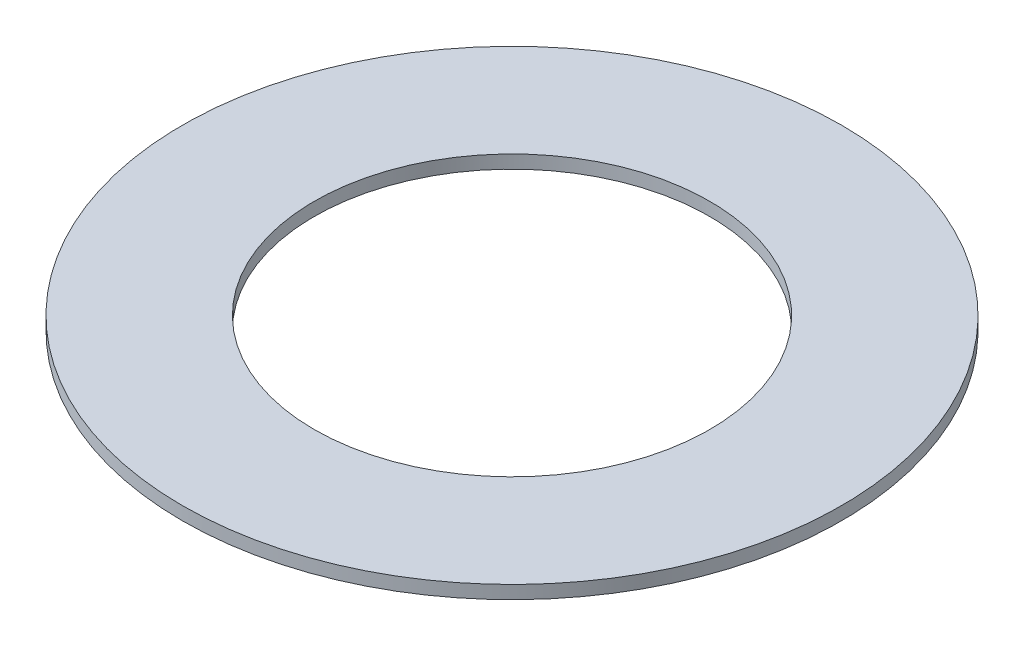
ISO-10303-21;
HEADER;
FILE_DESCRIPTION(('STEP AP214'),'2;1');
FILE_NAME('part.step','',(''),(''),'','','');
FILE_SCHEMA(('AUTOMOTIVE_DESIGN { 1 0 10303 214 1 1 1 1 }'));
ENDSEC;
DATA;
#1=APPLICATION_CONTEXT('core data for automotive mechanical design processes');
#2=APPLICATION_PROTOCOL_DEFINITION('international standard','automotive_design',2000,#1);
#3=PRODUCT_CONTEXT('',#1,'mechanical');
#4=PRODUCT('Part','Part','',(#3));
#5=PRODUCT_RELATED_PRODUCT_CATEGORY('part','',(#4));
#6=PRODUCT_DEFINITION_FORMATION('','',#4);
#7=PRODUCT_DEFINITION_CONTEXT('part definition',#1,'design');
#8=PRODUCT_DEFINITION('design','',#6,#7);
#9=PRODUCT_DEFINITION_SHAPE('','',#8);
#10=(LENGTH_UNIT() NAMED_UNIT(*) SI_UNIT(.MILLI.,.METRE.));
#11=(NAMED_UNIT(*) PLANE_ANGLE_UNIT() SI_UNIT($,.RADIAN.));
#12=(NAMED_UNIT(*) SI_UNIT($,.STERADIAN.) SOLID_ANGLE_UNIT());
#13=UNCERTAINTY_MEASURE_WITH_UNIT(LENGTH_MEASURE(1.E-05),#10,'distance_accuracy_value','');
#14=(GEOMETRIC_REPRESENTATION_CONTEXT(3) GLOBAL_UNCERTAINTY_ASSIGNED_CONTEXT((#13)) GLOBAL_UNIT_ASSIGNED_CONTEXT((#10,
#11,#12)) REPRESENTATION_CONTEXT('',''));
#15=CARTESIAN_POINT('',(0.,0.,0.));
#16=DIRECTION('',(0.,0.,1.));
#17=DIRECTION('',(1.,0.,0.));
#18=AXIS2_PLACEMENT_3D('',#15,#16,#17);
#19=CARTESIAN_POINT('',(0.,0.2,0.));
#20=DIRECTION('',(0.,1.,0.));
#21=DIRECTION('',(0.,0.,1.));
#22=AXIS2_PLACEMENT_3D('',#19,#20,#21);
#23=PLANE('',#22);
#24=CARTESIAN_POINT('',(0.,0.2,0.));
#25=DIRECTION('',(0.,1.,0.));
#26=DIRECTION('',(0.,0.,1.));
#27=AXIS2_PLACEMENT_3D('',#24,#25,#26);
#28=CIRCLE('',#27,5.);
#29=CARTESIAN_POINT('',(0.,0.2,5.));
#30=VERTEX_POINT('',#29);
#31=EDGE_CURVE('E11',#30,#30,#28,.T.);
#32=ORIENTED_EDGE('',*,*,#31,.T.);
#33=EDGE_LOOP('',(#32));
#34=FACE_BOUND('',#33,.T.);
#35=CARTESIAN_POINT('',(0.,0.2,0.));
#36=DIRECTION('',(0.,1.,0.));
#37=DIRECTION('',(0.,0.,1.));
#38=AXIS2_PLACEMENT_3D('',#35,#36,#37);
#39=CIRCLE('',#38,3.);
#40=CARTESIAN_POINT('',(0.,0.2,3.));
#41=VERTEX_POINT('',#40);
#42=EDGE_CURVE('E50',#41,#41,#39,.T.);
#43=ORIENTED_EDGE('',*,*,#42,.F.);
#44=EDGE_LOOP('',(#43));
#45=FACE_BOUND('',#44,.T.);
#46=ADVANCED_FACE('F39',(#34,#45),#23,.T.);
#47=CARTESIAN_POINT('',(0.,0.,0.));
#48=DIRECTION('',(0.,1.,0.));
#49=DIRECTION('',(0.,0.,1.));
#50=AXIS2_PLACEMENT_3D('',#47,#48,#49);
#51=PLANE('',#50);
#52=CARTESIAN_POINT('',(0.,0.,0.));
#53=DIRECTION('',(0.,1.,0.));
#54=DIRECTION('',(0.,0.,1.));
#55=AXIS2_PLACEMENT_3D('',#52,#53,#54);
#56=CIRCLE('',#55,5.);
#57=CARTESIAN_POINT('',(0.,0.,5.));
#58=VERTEX_POINT('',#57);
#59=EDGE_CURVE('E43',#58,#58,#56,.T.);
#60=ORIENTED_EDGE('',*,*,#59,.F.);
#61=EDGE_LOOP('',(#60));
#62=FACE_BOUND('',#61,.T.);
#63=CARTESIAN_POINT('',(0.,0.,0.));
#64=DIRECTION('',(0.,1.,0.));
#65=DIRECTION('',(0.,0.,1.));
#66=AXIS2_PLACEMENT_3D('',#63,#64,#65);
#67=CIRCLE('',#66,3.);
#68=CARTESIAN_POINT('',(0.,0.,3.));
#69=VERTEX_POINT('',#68);
#70=EDGE_CURVE('E52',#69,#69,#67,.T.);
#71=ORIENTED_EDGE('',*,*,#70,.T.);
#72=EDGE_LOOP('',(#71));
#73=FACE_BOUND('',#72,.T.);
#74=ADVANCED_FACE('F62',(#62,#73),#51,.F.);
#75=CARTESIAN_POINT('',(0.,0.2,0.));
#76=DIRECTION('',(0.,-1.,0.));
#77=DIRECTION('',(0.,0.,-1.));
#78=AXIS2_PLACEMENT_3D('',#75,#76,#77);
#79=CYLINDRICAL_SURFACE('',#78,5.);
#80=ORIENTED_EDGE('',*,*,#31,.F.);
#81=EDGE_LOOP('',(#80));
#82=FACE_BOUND('',#81,.T.);
#83=ORIENTED_EDGE('',*,*,#59,.T.);
#84=EDGE_LOOP('',(#83));
#85=FACE_BOUND('',#84,.T.);
#86=ADVANCED_FACE('F41',(#82,#85),#79,.T.);
#87=CARTESIAN_POINT('',(0.,0.2,0.));
#88=DIRECTION('',(0.,-1.,0.));
#89=DIRECTION('',(0.,0.,-1.));
#90=AXIS2_PLACEMENT_3D('',#87,#88,#89);
#91=CYLINDRICAL_SURFACE('',#90,3.);
#92=ORIENTED_EDGE('',*,*,#42,.T.);
#93=EDGE_LOOP('',(#92));
#94=FACE_BOUND('',#93,.T.);
#95=ORIENTED_EDGE('',*,*,#70,.F.);
#96=EDGE_LOOP('',(#95));
#97=FACE_BOUND('',#96,.T.);
#98=ADVANCED_FACE('F58',(#94,#97),#91,.F.);
#99=CLOSED_SHELL('',(#46,#74,#86,#98));
#100=MANIFOLD_SOLID_BREP('B2',#99);
#101=ADVANCED_BREP_SHAPE_REPRESENTATION('',(#18,#100),#14);
#102=SHAPE_DEFINITION_REPRESENTATION(#9,#101);
ENDSEC;
END-ISO-10303-21;
